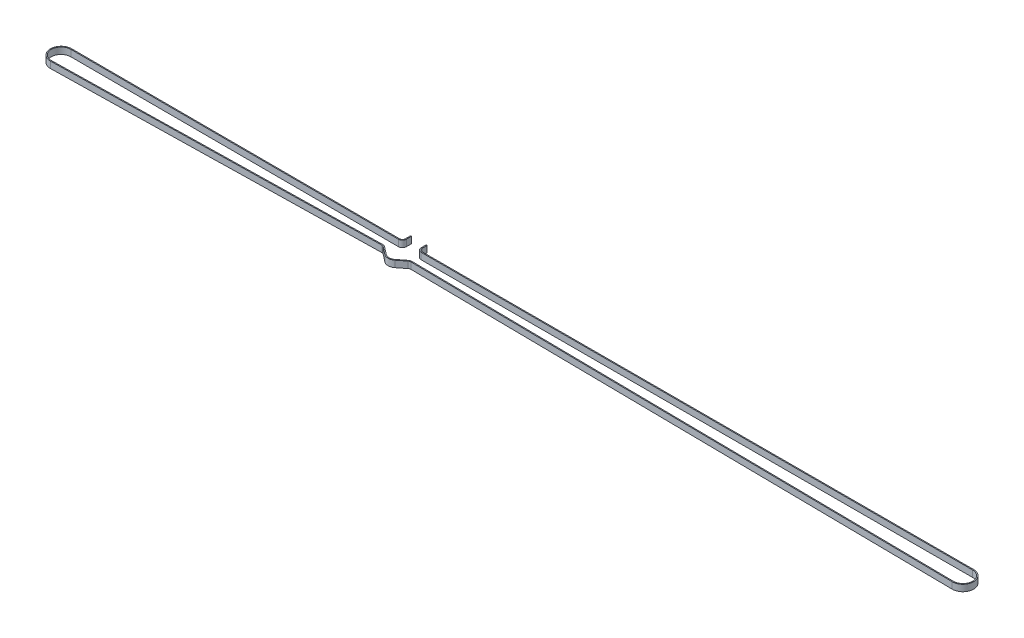
ISO-10303-21;
HEADER;
FILE_DESCRIPTION(('STEP AP214'),'2;1');
FILE_NAME('part.step','',(''),(''),'','','');
FILE_SCHEMA(('AUTOMOTIVE_DESIGN { 1 0 10303 214 1 1 1 1 }'));
ENDSEC;
DATA;
#1=APPLICATION_CONTEXT('core data for automotive mechanical design processes');
#2=APPLICATION_PROTOCOL_DEFINITION('international standard','automotive_design',2000,#1);
#3=PRODUCT_CONTEXT('',#1,'mechanical');
#4=PRODUCT('Part','Part','',(#3));
#5=PRODUCT_RELATED_PRODUCT_CATEGORY('part','',(#4));
#6=PRODUCT_DEFINITION_FORMATION('','',#4);
#7=PRODUCT_DEFINITION_CONTEXT('part definition',#1,'design');
#8=PRODUCT_DEFINITION('design','',#6,#7);
#9=PRODUCT_DEFINITION_SHAPE('','',#8);
#10=(LENGTH_UNIT() NAMED_UNIT(*) SI_UNIT(.MILLI.,.METRE.));
#11=(NAMED_UNIT(*) PLANE_ANGLE_UNIT() SI_UNIT($,.RADIAN.));
#12=(NAMED_UNIT(*) SI_UNIT($,.STERADIAN.) SOLID_ANGLE_UNIT());
#13=UNCERTAINTY_MEASURE_WITH_UNIT(LENGTH_MEASURE(1.E-05),#10,'distance_accuracy_value','');
#14=(GEOMETRIC_REPRESENTATION_CONTEXT(3) GLOBAL_UNCERTAINTY_ASSIGNED_CONTEXT((#13)) GLOBAL_UNIT_ASSIGNED_CONTEXT((#10,
#11,#12)) REPRESENTATION_CONTEXT('',''));
#15=CARTESIAN_POINT('',(0.,0.,0.));
#16=DIRECTION('',(0.,0.,1.));
#17=DIRECTION('',(1.,0.,0.));
#18=AXIS2_PLACEMENT_3D('',#15,#16,#17);
#19=CARTESIAN_POINT('',(-159.099999189377,5.,-27.99999999992));
#20=DIRECTION('',(-1.,0.,0.));
#21=DIRECTION('',(0.,0.,1.));
#22=AXIS2_PLACEMENT_3D('',#19,#20,#21);
#23=PLANE('',#22);
#24=DIRECTION('',(0.,0.,-1.));
#25=VECTOR('',#24,1.);
#26=CARTESIAN_POINT('',(-159.099999189377,-5.,-27.99999999992));
#27=LINE('',#26,#25);
#28=CARTESIAN_POINT('',(-159.099999189377,-5.,-19.99999999992));
#29=VERTEX_POINT('',#28);
#30=CARTESIAN_POINT('',(-159.099999189377,-5.,-27.99999999992));
#31=VERTEX_POINT('',#30);
#32=EDGE_CURVE('E276',#29,#31,#27,.T.);
#33=ORIENTED_EDGE('',*,*,#32,.T.);
#34=DIRECTION('',(0.,-1.,0.));
#35=VECTOR('',#34,1.);
#36=CARTESIAN_POINT('',(-159.099999189377,5.,-27.99999999992));
#37=LINE('',#36,#35);
#38=CARTESIAN_POINT('',(-159.099999189377,5.,-27.99999999992));
#39=VERTEX_POINT('',#38);
#40=EDGE_CURVE('E11',#39,#31,#37,.T.);
#41=ORIENTED_EDGE('',*,*,#40,.F.);
#42=DIRECTION('',(0.,0.,-1.));
#43=VECTOR('',#42,1.);
#44=CARTESIAN_POINT('',(-159.099999189377,5.,-27.99999999992));
#45=LINE('',#44,#43);
#46=CARTESIAN_POINT('',(-159.099999189377,5.,-19.99999999992));
#47=VERTEX_POINT('',#46);
#48=EDGE_CURVE('E165',#47,#39,#45,.T.);
#49=ORIENTED_EDGE('',*,*,#48,.F.);
#50=DIRECTION('',(0.,-1.,0.));
#51=VECTOR('',#50,1.);
#52=CARTESIAN_POINT('',(-159.099999189377,5.,-19.99999999992));
#53=LINE('',#52,#51);
#54=EDGE_CURVE('E272',#47,#29,#53,.T.);
#55=ORIENTED_EDGE('',*,*,#54,.T.);
#56=EDGE_LOOP('',(#33,#41,#49,#55));
#57=FACE_BOUND('',#56,.T.);
#58=ADVANCED_FACE('F37',(#57),#23,.F.);
#59=CARTESIAN_POINT('',(-160.599999189377,5.,-27.99999999992));
#60=DIRECTION('',(0.,0.,-1.));
#61=DIRECTION('',(-1.,0.,0.));
#62=AXIS2_PLACEMENT_3D('',#59,#60,#61);
#63=PLANE('',#62);
#64=DIRECTION('',(1.,0.,0.));
#65=VECTOR('',#64,1.);
#66=CARTESIAN_POINT('',(-160.599999189377,-5.,-27.99999999992));
#67=LINE('',#66,#65);
#68=CARTESIAN_POINT('',(-160.599999189377,-5.,-27.99999999992));
#69=VERTEX_POINT('',#68);
#70=EDGE_CURVE('E279',#69,#31,#67,.T.);
#71=ORIENTED_EDGE('',*,*,#70,.F.);
#72=DIRECTION('',(0.,-1.,0.));
#73=VECTOR('',#72,1.);
#74=CARTESIAN_POINT('',(-160.599999189377,5.,-27.99999999992));
#75=LINE('',#74,#73);
#76=CARTESIAN_POINT('',(-160.599999189377,5.,-27.99999999992));
#77=VERTEX_POINT('',#76);
#78=EDGE_CURVE('E45',#77,#69,#75,.T.);
#79=ORIENTED_EDGE('',*,*,#78,.F.);
#80=DIRECTION('',(1.,0.,0.));
#81=VECTOR('',#80,1.);
#82=CARTESIAN_POINT('',(-160.599999189377,5.,-27.99999999992));
#83=LINE('',#82,#81);
#84=EDGE_CURVE('E441',#77,#39,#83,.T.);
#85=ORIENTED_EDGE('',*,*,#84,.T.);
#86=ORIENTED_EDGE('',*,*,#40,.T.);
#87=EDGE_LOOP('',(#71,#79,#85,#86));
#88=FACE_BOUND('',#87,.T.);
#89=ADVANCED_FACE('F428',(#88),#63,.T.);
#90=CARTESIAN_POINT('',(-160.599999189377,5.,-27.99999999992));
#91=DIRECTION('',(-1.,0.,0.));
#92=DIRECTION('',(0.,0.,1.));
#93=AXIS2_PLACEMENT_3D('',#90,#91,#92);
#94=PLANE('',#93);
#95=DIRECTION('',(0.,0.,-1.));
#96=VECTOR('',#95,1.);
#97=CARTESIAN_POINT('',(-160.599999189377,-5.,-27.99999999992));
#98=LINE('',#97,#96);
#99=CARTESIAN_POINT('',(-160.599999189377,-5.,-19.99999999992));
#100=VERTEX_POINT('',#99);
#101=EDGE_CURVE('E282',#100,#69,#98,.T.);
#102=ORIENTED_EDGE('',*,*,#101,.F.);
#103=DIRECTION('',(0.,-1.,0.));
#104=VECTOR('',#103,1.);
#105=CARTESIAN_POINT('',(-160.599999189377,5.,-19.99999999992));
#106=LINE('',#105,#104);
#107=CARTESIAN_POINT('',(-160.599999189377,5.,-19.99999999992));
#108=VERTEX_POINT('',#107);
#109=EDGE_CURVE('E418',#108,#100,#106,.T.);
#110=ORIENTED_EDGE('',*,*,#109,.F.);
#111=DIRECTION('',(0.,0.,-1.));
#112=VECTOR('',#111,1.);
#113=CARTESIAN_POINT('',(-160.599999189377,5.,-27.99999999992));
#114=LINE('',#113,#112);
#115=EDGE_CURVE('E425',#108,#77,#114,.T.);
#116=ORIENTED_EDGE('',*,*,#115,.T.);
#117=ORIENTED_EDGE('',*,*,#78,.T.);
#118=EDGE_LOOP('',(#102,#110,#116,#117));
#119=FACE_BOUND('',#118,.T.);
#120=ADVANCED_FACE('F423',(#119),#94,.T.);
#121=CARTESIAN_POINT('',(-154.599995052563,5.,-19.99999999992));
#122=DIRECTION('',(0.,-1.,0.));
#123=DIRECTION('',(0.,0.,-1.));
#124=AXIS2_PLACEMENT_3D('',#121,#122,#123);
#125=CYLINDRICAL_SURFACE('',#124,6.0000041368137);
#126=CARTESIAN_POINT('',(-154.599995052563,-5.,-19.99999999992));
#127=DIRECTION('',(0.,-1.,0.));
#128=DIRECTION('',(0.,0.,1.));
#129=AXIS2_PLACEMENT_3D('',#126,#127,#128);
#130=CIRCLE('',#129,6.0000041368137);
#131=CARTESIAN_POINT('',(-154.592949360067,-5.,-13.9999999999201));
#132=VERTEX_POINT('',#131);
#133=EDGE_CURVE('E285',#132,#100,#130,.T.);
#134=ORIENTED_EDGE('',*,*,#133,.F.);
#135=DIRECTION('',(0.,-1.,0.));
#136=VECTOR('',#135,1.);
#137=CARTESIAN_POINT('',(-154.592949360067,5.,-13.9999999999201));
#138=LINE('',#137,#136);
#139=CARTESIAN_POINT('',(-154.592949360067,5.,-13.9999999999201));
#140=VERTEX_POINT('',#139);
#141=EDGE_CURVE('E416',#140,#132,#138,.T.);
#142=ORIENTED_EDGE('',*,*,#141,.F.);
#143=CARTESIAN_POINT('',(-154.599995052563,5.,-19.99999999992));
#144=DIRECTION('',(0.,-1.,0.));
#145=DIRECTION('',(0.,0.,1.));
#146=AXIS2_PLACEMENT_3D('',#143,#144,#145);
#147=CIRCLE('',#146,6.0000041368137);
#148=EDGE_CURVE('E438',#140,#108,#147,.T.);
#149=ORIENTED_EDGE('',*,*,#148,.T.);
#150=ORIENTED_EDGE('',*,*,#109,.T.);
#151=EDGE_LOOP('',(#134,#142,#149,#150));
#152=FACE_BOUND('',#151,.T.);
#153=ADVANCED_FACE('F435',(#152),#125,.T.);
#154=CARTESIAN_POINT('',(-154.592949360067,5.,-13.9999999999201));
#155=DIRECTION('',(0.00117428127298408,0.,0.999999310531508));
#156=DIRECTION('',(0.999999310531508,0.,-0.00117428127298408));
#157=AXIS2_PLACEMENT_3D('',#154,#155,#156);
#158=PLANE('',#157);
#159=DIRECTION('',(-0.999999310531508,0.,0.00117428127298408));
#160=VECTOR('',#159,1.);
#161=CARTESIAN_POINT('',(-154.592949360067,-5.,-13.9999999999201));
#162=LINE('',#161,#160);
#163=CARTESIAN_POINT('',(696.982385780905,-5.,-14.9999896579726));
#164=VERTEX_POINT('',#163);
#165=EDGE_CURVE('E288',#164,#132,#162,.T.);
#166=ORIENTED_EDGE('',*,*,#165,.F.);
#167=DIRECTION('',(0.,-1.,0.));
#168=VECTOR('',#167,1.);
#169=CARTESIAN_POINT('',(696.982385780905,5.,-14.9999896579726));
#170=LINE('',#169,#168);
#171=CARTESIAN_POINT('',(696.982385780905,5.,-14.9999896579726));
#172=VERTEX_POINT('',#171);
#173=EDGE_CURVE('E414',#172,#164,#170,.T.);
#174=ORIENTED_EDGE('',*,*,#173,.F.);
#175=DIRECTION('',(-0.999999310531508,0.,0.00117428127298408));
#176=VECTOR('',#175,1.);
#177=CARTESIAN_POINT('',(-154.592949360067,5.,-13.9999999999201));
#178=LINE('',#177,#176);
#179=EDGE_CURVE('E443',#172,#140,#178,.T.);
#180=ORIENTED_EDGE('',*,*,#179,.T.);
#181=ORIENTED_EDGE('',*,*,#141,.T.);
#182=EDGE_LOOP('',(#166,#174,#180,#181));
#183=FACE_BOUND('',#182,.T.);
#184=ADVANCED_FACE('F539',(#183),#158,.T.);
#185=CARTESIAN_POINT('',(697.,5.,0.));
#186=DIRECTION('',(0.,-1.,0.));
#187=DIRECTION('',(0.,0.,-1.));
#188=AXIS2_PLACEMENT_3D('',#185,#186,#187);
#189=CYLINDRICAL_SURFACE('',#188,15.);
#190=CARTESIAN_POINT('',(697.,-5.,0.));
#191=DIRECTION('',(0.,1.,0.));
#192=DIRECTION('',(0.,0.,1.));
#193=AXIS2_PLACEMENT_3D('',#190,#191,#192);
#194=CIRCLE('',#193,15.);
#195=CARTESIAN_POINT('',(696.826189087548,-5.,14.9989929584193));
#196=VERTEX_POINT('',#195);
#197=EDGE_CURVE('E291',#196,#164,#194,.T.);
#198=ORIENTED_EDGE('',*,*,#197,.F.);
#199=DIRECTION('',(0.,-1.,0.));
#200=VECTOR('',#199,1.);
#201=CARTESIAN_POINT('',(696.826189087548,5.,14.9989929584193));
#202=LINE('',#201,#200);
#203=CARTESIAN_POINT('',(696.826189087548,5.,14.9989929584193));
#204=VERTEX_POINT('',#203);
#205=EDGE_CURVE('E412',#204,#196,#202,.T.);
#206=ORIENTED_EDGE('',*,*,#205,.F.);
#207=CARTESIAN_POINT('',(697.,5.,0.));
#208=DIRECTION('',(0.,1.,0.));
#209=DIRECTION('',(0.,0.,1.));
#210=AXIS2_PLACEMENT_3D('',#207,#208,#209);
#211=CIRCLE('',#210,15.);
#212=EDGE_CURVE('E449',#204,#172,#211,.T.);
#213=ORIENTED_EDGE('',*,*,#212,.T.);
#214=ORIENTED_EDGE('',*,*,#173,.T.);
#215=EDGE_LOOP('',(#198,#206,#213,#214));
#216=FACE_BOUND('',#215,.T.);
#217=ADVANCED_FACE('F542',(#216),#189,.F.);
#218=CARTESIAN_POINT('',(-149.524681206787,5.,5.19133337567673));
#219=DIRECTION('',(0.0115873941634452,0.,-0.999932863894622));
#220=DIRECTION('',(-0.999932863894622,0.,-0.0115873941634452));
#221=AXIS2_PLACEMENT_3D('',#218,#219,#220);
#222=PLANE('',#221);
#223=DIRECTION('',(0.999932863894622,0.,0.0115873941634452));
#224=VECTOR('',#223,1.);
#225=CARTESIAN_POINT('',(-149.524681206787,-5.,5.19133337567673));
#226=LINE('',#225,#224);
#227=CARTESIAN_POINT('',(-149.524681206787,-5.,5.19133337567673));
#228=VERTEX_POINT('',#227);
#229=EDGE_CURVE('E294',#228,#196,#226,.T.);
#230=ORIENTED_EDGE('',*,*,#229,.F.);
#231=DIRECTION('',(0.,-1.,0.));
#232=VECTOR('',#231,1.);
#233=CARTESIAN_POINT('',(-149.524681206787,5.,5.19133337567673));
#234=LINE('',#233,#232);
#235=CARTESIAN_POINT('',(-149.524681206787,5.,5.19133337567673));
#236=VERTEX_POINT('',#235);
#237=EDGE_CURVE('E410',#236,#228,#234,.T.);
#238=ORIENTED_EDGE('',*,*,#237,.F.);
#239=DIRECTION('',(0.999932863894622,0.,0.0115873941634452));
#240=VECTOR('',#239,1.);
#241=CARTESIAN_POINT('',(-149.524681206787,5.,5.19133337567673));
#242=LINE('',#241,#240);
#243=EDGE_CURVE('E452',#236,#204,#242,.T.);
#244=ORIENTED_EDGE('',*,*,#243,.T.);
#245=ORIENTED_EDGE('',*,*,#205,.T.);
#246=EDGE_LOOP('',(#230,#238,#244,#245));
#247=FACE_BOUND('',#246,.T.);
#248=ADVANCED_FACE('F546',(#247),#222,.T.);
#249=CARTESIAN_POINT('',(-149.599999268849,5.,11.6908969909918));
#250=DIRECTION('',(0.,-1.,0.));
#251=DIRECTION('',(0.,0.,-1.));
#252=AXIS2_PLACEMENT_3D('',#249,#250,#251);
#253=CYLINDRICAL_SURFACE('',#252,6.49999999999999);
#254=CARTESIAN_POINT('',(-149.599999268849,-5.,11.6908969909918));
#255=DIRECTION('',(0.,-1.,0.));
#256=DIRECTION('',(0.,0.,1.));
#257=AXIS2_PLACEMENT_3D('',#254,#255,#256);
#258=CIRCLE('',#257,6.49999999999999);
#259=CARTESIAN_POINT('',(-153.606210927465,-5.,6.57227724086695));
#260=VERTEX_POINT('',#259);
#261=EDGE_CURVE('E297',#260,#228,#258,.T.);
#262=ORIENTED_EDGE('',*,*,#261,.F.);
#263=DIRECTION('',(0.,-1.,0.));
#264=VECTOR('',#263,1.);
#265=CARTESIAN_POINT('',(-153.606210927465,5.,6.57227724086695));
#266=LINE('',#265,#264);
#267=CARTESIAN_POINT('',(-153.606210927465,5.,6.57227724086695));
#268=VERTEX_POINT('',#267);
#269=EDGE_CURVE('E408',#268,#260,#266,.T.);
#270=ORIENTED_EDGE('',*,*,#269,.F.);
#271=CARTESIAN_POINT('',(-149.599999268849,5.,11.6908969909918));
#272=DIRECTION('',(0.,-1.,0.));
#273=DIRECTION('',(0.,0.,1.));
#274=AXIS2_PLACEMENT_3D('',#271,#272,#273);
#275=CIRCLE('',#274,6.49999999999999);
#276=EDGE_CURVE('E455',#268,#236,#275,.T.);
#277=ORIENTED_EDGE('',*,*,#276,.T.);
#278=ORIENTED_EDGE('',*,*,#237,.T.);
#279=EDGE_LOOP('',(#262,#270,#277,#278));
#280=FACE_BOUND('',#279,.T.);
#281=ADVANCED_FACE('F550',(#280),#253,.T.);
#282=CARTESIAN_POINT('',(-165.220257193111,5.,15.6622917026761));
#283=DIRECTION('',(-0.616340255171715,0.,-0.787479961557667));
#284=DIRECTION('',(-0.787479961557667,0.,0.616340255171715));
#285=AXIS2_PLACEMENT_3D('',#282,#283,#284);
#286=PLANE('',#285);
#287=DIRECTION('',(0.787479961557667,0.,-0.616340255171715));
#288=VECTOR('',#287,1.);
#289=CARTESIAN_POINT('',(-165.220257193111,-5.,15.6622917026761));
#290=LINE('',#289,#288);
#291=CARTESIAN_POINT('',(-165.220257193111,-5.,15.6622917026761));
#292=VERTEX_POINT('',#291);
#293=EDGE_CURVE('E300',#292,#260,#290,.T.);
#294=ORIENTED_EDGE('',*,*,#293,.F.);
#295=DIRECTION('',(0.,-1.,0.));
#296=VECTOR('',#295,1.);
#297=CARTESIAN_POINT('',(-165.220257193111,5.,15.6622917026761));
#298=LINE('',#297,#296);
#299=CARTESIAN_POINT('',(-165.220257193111,5.,15.6622917026761));
#300=VERTEX_POINT('',#299);
#301=EDGE_CURVE('E406',#300,#292,#298,.T.);
#302=ORIENTED_EDGE('',*,*,#301,.F.);
#303=DIRECTION('',(0.787479961557667,0.,-0.616340255171715));
#304=VECTOR('',#303,1.);
#305=CARTESIAN_POINT('',(-165.220257193111,5.,15.6622917026761));
#306=LINE('',#305,#304);
#307=EDGE_CURVE('E458',#300,#268,#306,.T.);
#308=ORIENTED_EDGE('',*,*,#307,.T.);
#309=ORIENTED_EDGE('',*,*,#269,.T.);
#310=EDGE_LOOP('',(#294,#302,#308,#309));
#311=FACE_BOUND('',#310,.T.);
#312=ADVANCED_FACE('F554',(#311),#286,.T.);
#313=CARTESIAN_POINT('',(-172.,5.,7.0000121255418));
#314=DIRECTION('',(0.,-1.,0.));
#315=DIRECTION('',(0.,0.,-1.));
#316=AXIS2_PLACEMENT_3D('',#313,#314,#315);
#317=CYLINDRICAL_SURFACE('',#316,11.);
#318=CARTESIAN_POINT('',(-172.,-5.,7.0000121255418));
#319=DIRECTION('',(0.,1.,0.));
#320=DIRECTION('',(0.,0.,1.));
#321=AXIS2_PLACEMENT_3D('',#318,#319,#320);
#322=CIRCLE('',#321,11.);
#323=CARTESIAN_POINT('',(-178.779742806889,-5.,15.6622917026761));
#324=VERTEX_POINT('',#323);
#325=EDGE_CURVE('E303',#324,#292,#322,.T.);
#326=ORIENTED_EDGE('',*,*,#325,.F.);
#327=DIRECTION('',(0.,-1.,0.));
#328=VECTOR('',#327,1.);
#329=CARTESIAN_POINT('',(-178.779742806889,5.,15.6622917026761));
#330=LINE('',#329,#328);
#331=CARTESIAN_POINT('',(-178.779742806889,5.,15.6622917026761));
#332=VERTEX_POINT('',#331);
#333=EDGE_CURVE('E404',#332,#324,#330,.T.);
#334=ORIENTED_EDGE('',*,*,#333,.F.);
#335=CARTESIAN_POINT('',(-172.,5.,7.0000121255418));
#336=DIRECTION('',(0.,1.,0.));
#337=DIRECTION('',(0.,0.,1.));
#338=AXIS2_PLACEMENT_3D('',#335,#336,#337);
#339=CIRCLE('',#338,11.);
#340=EDGE_CURVE('E461',#332,#300,#339,.T.);
#341=ORIENTED_EDGE('',*,*,#340,.T.);
#342=ORIENTED_EDGE('',*,*,#301,.T.);
#343=EDGE_LOOP('',(#326,#334,#341,#342));
#344=FACE_BOUND('',#343,.T.);
#345=ADVANCED_FACE('F558',(#344),#317,.F.);
#346=CARTESIAN_POINT('',(-190.393789072534,5.,6.57227724086698));
#347=DIRECTION('',(0.616340255171717,0.,-0.787479961557666));
#348=DIRECTION('',(-0.787479961557666,0.,-0.616340255171717));
#349=AXIS2_PLACEMENT_3D('',#346,#347,#348);
#350=PLANE('',#349);
#351=DIRECTION('',(0.787479961557666,0.,0.616340255171717));
#352=VECTOR('',#351,1.);
#353=CARTESIAN_POINT('',(-190.393789072534,-5.,6.57227724086698));
#354=LINE('',#353,#352);
#355=CARTESIAN_POINT('',(-190.393789072534,-5.,6.57227724086698));
#356=VERTEX_POINT('',#355);
#357=EDGE_CURVE('E306',#356,#324,#354,.T.);
#358=ORIENTED_EDGE('',*,*,#357,.F.);
#359=DIRECTION('',(0.,-1.,0.));
#360=VECTOR('',#359,1.);
#361=CARTESIAN_POINT('',(-190.393789072534,5.,6.57227724086698));
#362=LINE('',#361,#360);
#363=CARTESIAN_POINT('',(-190.393789072534,5.,6.57227724086698));
#364=VERTEX_POINT('',#363);
#365=EDGE_CURVE('E402',#364,#356,#362,.T.);
#366=ORIENTED_EDGE('',*,*,#365,.F.);
#367=DIRECTION('',(0.787479961557666,0.,0.616340255171717));
#368=VECTOR('',#367,1.);
#369=CARTESIAN_POINT('',(-190.393789072534,5.,6.57227724086698));
#370=LINE('',#369,#368);
#371=EDGE_CURVE('E464',#364,#332,#370,.T.);
#372=ORIENTED_EDGE('',*,*,#371,.T.);
#373=ORIENTED_EDGE('',*,*,#333,.T.);
#374=EDGE_LOOP('',(#358,#366,#372,#373));
#375=FACE_BOUND('',#374,.T.);
#376=ADVANCED_FACE('F562',(#375),#350,.T.);
#377=CARTESIAN_POINT('',(-194.400000731151,5.,11.6908969909918));
#378=DIRECTION('',(0.,-1.,0.));
#379=DIRECTION('',(0.,0.,-1.));
#380=AXIS2_PLACEMENT_3D('',#377,#378,#379);
#381=CYLINDRICAL_SURFACE('',#380,6.49999999999998);
#382=CARTESIAN_POINT('',(-194.400000731151,-5.,11.6908969909918));
#383=DIRECTION('',(0.,-1.,0.));
#384=DIRECTION('',(0.,0.,1.));
#385=AXIS2_PLACEMENT_3D('',#382,#383,#384);
#386=CIRCLE('',#385,6.49999999999998);
#387=CARTESIAN_POINT('',(-194.526888216522,-5.,5.19213560392302));
#388=VERTEX_POINT('',#387);
#389=EDGE_CURVE('E309',#388,#356,#386,.T.);
#390=ORIENTED_EDGE('',*,*,#389,.F.);
#391=DIRECTION('',(0.,-1.,0.));
#392=VECTOR('',#391,1.);
#393=CARTESIAN_POINT('',(-194.526888216522,5.,5.19213560392302));
#394=LINE('',#393,#392);
#395=CARTESIAN_POINT('',(-194.526888216522,5.,5.19213560392302));
#396=VERTEX_POINT('',#395);
#397=EDGE_CURVE('E400',#396,#388,#394,.T.);
#398=ORIENTED_EDGE('',*,*,#397,.F.);
#399=CARTESIAN_POINT('',(-194.400000731151,5.,11.6908969909918));
#400=DIRECTION('',(0.,-1.,0.));
#401=DIRECTION('',(0.,0.,1.));
#402=AXIS2_PLACEMENT_3D('',#399,#400,#401);
#403=CIRCLE('',#402,6.49999999999998);
#404=EDGE_CURVE('E467',#396,#364,#403,.T.);
#405=ORIENTED_EDGE('',*,*,#404,.T.);
#406=ORIENTED_EDGE('',*,*,#365,.T.);
#407=EDGE_LOOP('',(#390,#398,#405,#406));
#408=FACE_BOUND('',#407,.T.);
#409=ADVANCED_FACE('F566',(#408),#381,.T.);
#410=CARTESIAN_POINT('',(-696.707182726067,5.,14.9971416624664));
#411=DIRECTION('',(-0.0195211515955547,0.,-0.999809444164429));
#412=DIRECTION('',(-0.999809444164429,0.,0.0195211515955547));
#413=AXIS2_PLACEMENT_3D('',#410,#411,#412);
#414=PLANE('',#413);
#415=DIRECTION('',(0.999809444164429,0.,-0.0195211515955547));
#416=VECTOR('',#415,1.);
#417=CARTESIAN_POINT('',(-696.707182726067,-5.,14.9971416624664));
#418=LINE('',#417,#416);
#419=CARTESIAN_POINT('',(-696.707182726067,-5.,14.9971416624664));
#420=VERTEX_POINT('',#419);
#421=EDGE_CURVE('E312',#420,#388,#418,.T.);
#422=ORIENTED_EDGE('',*,*,#421,.F.);
#423=DIRECTION('',(0.,-1.,0.));
#424=VECTOR('',#423,1.);
#425=CARTESIAN_POINT('',(-696.707182726067,5.,14.9971416624664));
#426=LINE('',#425,#424);
#427=CARTESIAN_POINT('',(-696.707182726067,5.,14.9971416624664));
#428=VERTEX_POINT('',#427);
#429=EDGE_CURVE('E398',#428,#420,#426,.T.);
#430=ORIENTED_EDGE('',*,*,#429,.F.);
#431=DIRECTION('',(0.999809444164429,0.,-0.0195211515955547));
#432=VECTOR('',#431,1.);
#433=CARTESIAN_POINT('',(-696.707182726067,5.,14.9971416624664));
#434=LINE('',#433,#432);
#435=EDGE_CURVE('E470',#428,#396,#434,.T.);
#436=ORIENTED_EDGE('',*,*,#435,.T.);
#437=ORIENTED_EDGE('',*,*,#397,.T.);
#438=EDGE_LOOP('',(#422,#430,#436,#437));
#439=FACE_BOUND('',#438,.T.);
#440=ADVANCED_FACE('F570',(#439),#414,.T.);
#441=CARTESIAN_POINT('',(-697.,5.,0.));
#442=DIRECTION('',(0.,-1.,0.));
#443=DIRECTION('',(0.,0.,-1.));
#444=AXIS2_PLACEMENT_3D('',#441,#442,#443);
#445=CYLINDRICAL_SURFACE('',#444,15.);
#446=CARTESIAN_POINT('',(-697.,-5.,0.));
#447=DIRECTION('',(0.,1.,0.));
#448=DIRECTION('',(0.,0.,1.));
#449=AXIS2_PLACEMENT_3D('',#446,#447,#448);
#450=CIRCLE('',#449,15.);
#451=CARTESIAN_POINT('',(-696.970447680724,-5.,-14.9999708886526));
#452=VERTEX_POINT('',#451);
#453=EDGE_CURVE('E315',#452,#420,#450,.T.);
#454=ORIENTED_EDGE('',*,*,#453,.F.);
#455=DIRECTION('',(0.,-1.,0.));
#456=VECTOR('',#455,1.);
#457=CARTESIAN_POINT('',(-696.970447680724,5.,-14.9999708886526));
#458=LINE('',#457,#456);
#459=CARTESIAN_POINT('',(-696.970447680724,5.,-14.9999708886526));
#460=VERTEX_POINT('',#459);
#461=EDGE_CURVE('E396',#460,#452,#458,.T.);
#462=ORIENTED_EDGE('',*,*,#461,.F.);
#463=CARTESIAN_POINT('',(-697.,5.,0.));
#464=DIRECTION('',(0.,1.,0.));
#465=DIRECTION('',(0.,0.,1.));
#466=AXIS2_PLACEMENT_3D('',#463,#464,#465);
#467=CIRCLE('',#466,15.);
#468=EDGE_CURVE('E473',#460,#428,#467,.T.);
#469=ORIENTED_EDGE('',*,*,#468,.T.);
#470=ORIENTED_EDGE('',*,*,#429,.T.);
#471=EDGE_LOOP('',(#454,#462,#469,#470));
#472=FACE_BOUND('',#471,.T.);
#473=ADVANCED_FACE('F574',(#472),#445,.F.);
#474=CARTESIAN_POINT('',(-189.411833405837,5.,-13.9999999999201));
#475=DIRECTION('',(-0.00197015461842,0.,0.999998059243506));
#476=DIRECTION('',(0.999998059243506,0.,0.00197015461842));
#477=AXIS2_PLACEMENT_3D('',#474,#475,#476);
#478=PLANE('',#477);
#479=DIRECTION('',(-0.999998059243506,0.,-0.00197015461842));
#480=VECTOR('',#479,1.);
#481=CARTESIAN_POINT('',(-189.411833405837,-5.,-13.9999999999201));
#482=LINE('',#481,#480);
#483=CARTESIAN_POINT('',(-189.411833405837,-5.,-13.9999999999201));
#484=VERTEX_POINT('',#483);
#485=EDGE_CURVE('E318',#484,#452,#482,.T.);
#486=ORIENTED_EDGE('',*,*,#485,.F.);
#487=DIRECTION('',(0.,-1.,0.));
#488=VECTOR('',#487,1.);
#489=CARTESIAN_POINT('',(-189.411833405837,5.,-13.9999999999201));
#490=LINE('',#489,#488);
#491=CARTESIAN_POINT('',(-189.411833405837,5.,-13.9999999999201));
#492=VERTEX_POINT('',#491);
#493=EDGE_CURVE('E394',#492,#484,#490,.T.);
#494=ORIENTED_EDGE('',*,*,#493,.F.);
#495=DIRECTION('',(-0.999998059243506,0.,-0.00197015461842));
#496=VECTOR('',#495,1.);
#497=CARTESIAN_POINT('',(-189.411833405837,5.,-13.9999999999201));
#498=LINE('',#497,#496);
#499=EDGE_CURVE('E476',#492,#460,#498,.T.);
#500=ORIENTED_EDGE('',*,*,#499,.T.);
#501=ORIENTED_EDGE('',*,*,#461,.T.);
#502=EDGE_LOOP('',(#486,#494,#500,#501));
#503=FACE_BOUND('',#502,.T.);
#504=ADVANCED_FACE('F578',(#503),#478,.T.);
#505=CARTESIAN_POINT('',(-189.400012455185,5.,-19.99999999992));
#506=DIRECTION('',(0.,-1.,0.));
#507=DIRECTION('',(0.,0.,-1.));
#508=AXIS2_PLACEMENT_3D('',#505,#506,#507);
#509=CYLINDRICAL_SURFACE('',#508,6.00001164456146);
#510=CARTESIAN_POINT('',(-189.400012455185,-5.,-19.99999999992));
#511=DIRECTION('',(0.,-1.,0.));
#512=DIRECTION('',(0.,0.,-1.));
#513=AXIS2_PLACEMENT_3D('',#510,#511,#512);
#514=CIRCLE('',#513,6.00001164456146);
#515=CARTESIAN_POINT('',(-183.400000810623,-5.,-19.99999999992));
#516=VERTEX_POINT('',#515);
#517=EDGE_CURVE('E321',#516,#484,#514,.T.);
#518=ORIENTED_EDGE('',*,*,#517,.F.);
#519=DIRECTION('',(0.,-1.,0.));
#520=VECTOR('',#519,1.);
#521=CARTESIAN_POINT('',(-183.400000810623,5.,-19.99999999992));
#522=LINE('',#521,#520);
#523=CARTESIAN_POINT('',(-183.400000810623,5.,-19.99999999992));
#524=VERTEX_POINT('',#523);
#525=EDGE_CURVE('E392',#524,#516,#522,.T.);
#526=ORIENTED_EDGE('',*,*,#525,.F.);
#527=CARTESIAN_POINT('',(-189.400012455185,5.,-19.99999999992));
#528=DIRECTION('',(0.,-1.,0.));
#529=DIRECTION('',(0.,0.,-1.));
#530=AXIS2_PLACEMENT_3D('',#527,#528,#529);
#531=CIRCLE('',#530,6.00001164456146);
#532=EDGE_CURVE('E479',#524,#492,#531,.T.);
#533=ORIENTED_EDGE('',*,*,#532,.T.);
#534=ORIENTED_EDGE('',*,*,#493,.T.);
#535=EDGE_LOOP('',(#518,#526,#533,#534));
#536=FACE_BOUND('',#535,.T.);
#537=ADVANCED_FACE('F582',(#536),#509,.T.);
#538=CARTESIAN_POINT('',(-183.400000810623,5.,-27.99999999992));
#539=DIRECTION('',(1.,0.,0.));
#540=DIRECTION('',(0.,0.,-1.));
#541=AXIS2_PLACEMENT_3D('',#538,#539,#540);
#542=PLANE('',#541);
#543=DIRECTION('',(0.,0.,1.));
#544=VECTOR('',#543,1.);
#545=CARTESIAN_POINT('',(-183.400000810623,-5.,-27.99999999992));
#546=LINE('',#545,#544);
#547=CARTESIAN_POINT('',(-183.400000810623,-5.,-27.99999999992));
#548=VERTEX_POINT('',#547);
#549=EDGE_CURVE('E324',#548,#516,#546,.T.);
#550=ORIENTED_EDGE('',*,*,#549,.F.);
#551=DIRECTION('',(0.,-1.,0.));
#552=VECTOR('',#551,1.);
#553=CARTESIAN_POINT('',(-183.400000810623,5.,-27.99999999992));
#554=LINE('',#553,#552);
#555=CARTESIAN_POINT('',(-183.400000810623,5.,-27.99999999992));
#556=VERTEX_POINT('',#555);
#557=EDGE_CURVE('E390',#556,#548,#554,.T.);
#558=ORIENTED_EDGE('',*,*,#557,.F.);
#559=DIRECTION('',(0.,0.,1.));
#560=VECTOR('',#559,1.);
#561=CARTESIAN_POINT('',(-183.400000810623,5.,-27.99999999992));
#562=LINE('',#561,#560);
#563=EDGE_CURVE('E482',#556,#524,#562,.T.);
#564=ORIENTED_EDGE('',*,*,#563,.T.);
#565=ORIENTED_EDGE('',*,*,#525,.T.);
#566=EDGE_LOOP('',(#550,#558,#564,#565));
#567=FACE_BOUND('',#566,.T.);
#568=ADVANCED_FACE('F586',(#567),#542,.T.);
#569=CARTESIAN_POINT('',(-184.900000810623,5.,-27.99999999992));
#570=DIRECTION('',(0.,0.,-1.));
#571=DIRECTION('',(-1.,0.,0.));
#572=AXIS2_PLACEMENT_3D('',#569,#570,#571);
#573=PLANE('',#572);
#574=DIRECTION('',(1.,0.,0.));
#575=VECTOR('',#574,1.);
#576=CARTESIAN_POINT('',(-184.900000810623,-5.,-27.99999999992));
#577=LINE('',#576,#575);
#578=CARTESIAN_POINT('',(-184.900000810623,-5.,-27.99999999992));
#579=VERTEX_POINT('',#578);
#580=EDGE_CURVE('E327',#579,#548,#577,.T.);
#581=ORIENTED_EDGE('',*,*,#580,.F.);
#582=DIRECTION('',(0.,-1.,0.));
#583=VECTOR('',#582,1.);
#584=CARTESIAN_POINT('',(-184.900000810623,5.,-27.99999999992));
#585=LINE('',#584,#583);
#586=CARTESIAN_POINT('',(-184.900000810623,5.,-27.99999999992));
#587=VERTEX_POINT('',#586);
#588=EDGE_CURVE('E388',#587,#579,#585,.T.);
#589=ORIENTED_EDGE('',*,*,#588,.F.);
#590=DIRECTION('',(1.,0.,0.));
#591=VECTOR('',#590,1.);
#592=CARTESIAN_POINT('',(-184.900000810623,5.,-27.99999999992));
#593=LINE('',#592,#591);
#594=EDGE_CURVE('E485',#587,#556,#593,.T.);
#595=ORIENTED_EDGE('',*,*,#594,.T.);
#596=ORIENTED_EDGE('',*,*,#557,.T.);
#597=EDGE_LOOP('',(#581,#589,#595,#596));
#598=FACE_BOUND('',#597,.T.);
#599=ADVANCED_FACE('F590',(#598),#573,.T.);
#600=CARTESIAN_POINT('',(-184.900000810623,5.,-27.99999999992));
#601=DIRECTION('',(1.,0.,0.));
#602=DIRECTION('',(0.,0.,-1.));
#603=AXIS2_PLACEMENT_3D('',#600,#601,#602);
#604=PLANE('',#603);
#605=DIRECTION('',(0.,0.,-1.));
#606=VECTOR('',#605,1.);
#607=CARTESIAN_POINT('',(-184.900000810623,-5.,-27.99999999992));
#608=LINE('',#607,#606);
#609=CARTESIAN_POINT('',(-184.900000810623,-5.,-19.99999999992));
#610=VERTEX_POINT('',#609);
#611=EDGE_CURVE('E330',#579,#610,#608,.F.);
#612=ORIENTED_EDGE('',*,*,#611,.T.);
#613=DIRECTION('',(0.,-1.,0.));
#614=VECTOR('',#613,1.);
#615=CARTESIAN_POINT('',(-184.900000810623,5.,-19.99999999992));
#616=LINE('',#615,#614);
#617=CARTESIAN_POINT('',(-184.900000810623,5.,-19.99999999992));
#618=VERTEX_POINT('',#617);
#619=EDGE_CURVE('E385',#618,#610,#616,.T.);
#620=ORIENTED_EDGE('',*,*,#619,.F.);
#621=DIRECTION('',(0.,0.,-1.));
#622=VECTOR('',#621,1.);
#623=CARTESIAN_POINT('',(-184.900000810623,5.,-27.99999999992));
#624=LINE('',#623,#622);
#625=EDGE_CURVE('E488',#587,#618,#624,.F.);
#626=ORIENTED_EDGE('',*,*,#625,.F.);
#627=ORIENTED_EDGE('',*,*,#588,.T.);
#628=EDGE_LOOP('',(#612,#620,#626,#627));
#629=FACE_BOUND('',#628,.T.);
#630=ADVANCED_FACE('F594',(#629),#604,.F.);
#631=CARTESIAN_POINT('',(-189.400012455185,5.,-19.99999999992));
#632=DIRECTION('',(0.,-1.,0.));
#633=DIRECTION('',(0.,0.,-1.));
#634=AXIS2_PLACEMENT_3D('',#631,#632,#633);
#635=CYLINDRICAL_SURFACE('',#634,4.50001164456146);
#636=CARTESIAN_POINT('',(-189.400012455185,-5.,-19.99999999992));
#637=DIRECTION('',(0.,1.,0.));
#638=DIRECTION('',(1.,0.,0.));
#639=AXIS2_PLACEMENT_3D('',#636,#637,#638);
#640=CIRCLE('',#639,4.50001164456146);
#641=CARTESIAN_POINT('',(-189.408878173909,-5.,-15.4999970887853));
#642=VERTEX_POINT('',#641);
#643=EDGE_CURVE('E332',#610,#642,#640,.F.);
#644=ORIENTED_EDGE('',*,*,#643,.T.);
#645=DIRECTION('',(0.,-1.,0.));
#646=VECTOR('',#645,1.);
#647=CARTESIAN_POINT('',(-189.408878173909,5.,-15.4999970887853));
#648=LINE('',#647,#646);
#649=CARTESIAN_POINT('',(-189.408878173909,5.,-15.4999970887853));
#650=VERTEX_POINT('',#649);
#651=EDGE_CURVE('E382',#650,#642,#648,.T.);
#652=ORIENTED_EDGE('',*,*,#651,.F.);
#653=CARTESIAN_POINT('',(-189.400012455185,5.,-19.99999999992));
#654=DIRECTION('',(0.,1.,0.));
#655=DIRECTION('',(1.,0.,0.));
#656=AXIS2_PLACEMENT_3D('',#653,#654,#655);
#657=CIRCLE('',#656,4.50001164456146);
#658=EDGE_CURVE('E490',#618,#650,#657,.F.);
#659=ORIENTED_EDGE('',*,*,#658,.F.);
#660=ORIENTED_EDGE('',*,*,#619,.T.);
#661=EDGE_LOOP('',(#644,#652,#659,#660));
#662=FACE_BOUND('',#661,.T.);
#663=ADVANCED_FACE('F598',(#662),#635,.F.);
#664=CARTESIAN_POINT('',(-189.408878173909,5.,-15.4999970887853));
#665=DIRECTION('',(-0.00197015461842,0.,0.999998059243506));
#666=DIRECTION('',(0.999998059243506,0.,0.00197015461842));
#667=AXIS2_PLACEMENT_3D('',#664,#665,#666);
#668=PLANE('',#667);
#669=DIRECTION('',(-0.999998059243506,0.,-0.00197015461842));
#670=VECTOR('',#669,1.);
#671=CARTESIAN_POINT('',(-189.408878173909,-5.,-15.4999970887853));
#672=LINE('',#671,#670);
#673=CARTESIAN_POINT('',(-696.967492448796,-5.,-16.4999679775179));
#674=VERTEX_POINT('',#673);
#675=EDGE_CURVE('E334',#642,#674,#672,.T.);
#676=ORIENTED_EDGE('',*,*,#675,.T.);
#677=DIRECTION('',(0.,-1.,0.));
#678=VECTOR('',#677,1.);
#679=CARTESIAN_POINT('',(-696.967492448796,5.,-16.4999679775179));
#680=LINE('',#679,#678);
#681=CARTESIAN_POINT('',(-696.967492448796,5.,-16.4999679775179));
#682=VERTEX_POINT('',#681);
#683=EDGE_CURVE('E379',#682,#674,#680,.T.);
#684=ORIENTED_EDGE('',*,*,#683,.F.);
#685=DIRECTION('',(-0.999998059243506,0.,-0.00197015461842));
#686=VECTOR('',#685,1.);
#687=CARTESIAN_POINT('',(-189.408878173909,5.,-15.4999970887853));
#688=LINE('',#687,#686);
#689=EDGE_CURVE('E492',#650,#682,#688,.T.);
#690=ORIENTED_EDGE('',*,*,#689,.F.);
#691=ORIENTED_EDGE('',*,*,#651,.T.);
#692=EDGE_LOOP('',(#676,#684,#690,#691));
#693=FACE_BOUND('',#692,.T.);
#694=ADVANCED_FACE('F602',(#693),#668,.F.);
#695=CARTESIAN_POINT('',(-697.,5.,0.));
#696=DIRECTION('',(0.,-1.,0.));
#697=DIRECTION('',(0.,0.,-1.));
#698=AXIS2_PLACEMENT_3D('',#695,#696,#697);
#699=CYLINDRICAL_SURFACE('',#698,16.5);
#700=CARTESIAN_POINT('',(-697.,-5.,0.));
#701=DIRECTION('',(0.,1.,0.));
#702=DIRECTION('',(1.,0.,0.));
#703=AXIS2_PLACEMENT_3D('',#700,#701,#702);
#704=CIRCLE('',#703,16.5);
#705=CARTESIAN_POINT('',(-696.677900998673,-5.,16.4968558287131));
#706=VERTEX_POINT('',#705);
#707=EDGE_CURVE('E336',#674,#706,#704,.T.);
#708=ORIENTED_EDGE('',*,*,#707,.T.);
#709=DIRECTION('',(0.,-1.,0.));
#710=VECTOR('',#709,1.);
#711=CARTESIAN_POINT('',(-696.677900998673,5.,16.4968558287131));
#712=LINE('',#711,#710);
#713=CARTESIAN_POINT('',(-696.677900998673,5.,16.4968558287131));
#714=VERTEX_POINT('',#713);
#715=EDGE_CURVE('E376',#714,#706,#712,.T.);
#716=ORIENTED_EDGE('',*,*,#715,.F.);
#717=CARTESIAN_POINT('',(-697.,5.,0.));
#718=DIRECTION('',(0.,1.,0.));
#719=DIRECTION('',(1.,0.,0.));
#720=AXIS2_PLACEMENT_3D('',#717,#718,#719);
#721=CIRCLE('',#720,16.5);
#722=EDGE_CURVE('E494',#682,#714,#721,.T.);
#723=ORIENTED_EDGE('',*,*,#722,.F.);
#724=ORIENTED_EDGE('',*,*,#683,.T.);
#725=EDGE_LOOP('',(#708,#716,#723,#724));
#726=FACE_BOUND('',#725,.T.);
#727=ADVANCED_FACE('F606',(#726),#699,.T.);
#728=CARTESIAN_POINT('',(-696.677900998673,5.,16.4968558287131));
#729=DIRECTION('',(-0.0195211515955547,0.,-0.999809444164429));
#730=DIRECTION('',(-0.999809444164429,0.,0.0195211515955547));
#731=AXIS2_PLACEMENT_3D('',#728,#729,#730);
#732=PLANE('',#731);
#733=DIRECTION('',(0.999809444164429,0.,-0.0195211515955547));
#734=VECTOR('',#733,1.);
#735=CARTESIAN_POINT('',(-696.677900998673,-5.,16.4968558287131));
#736=LINE('',#735,#734);
#737=CARTESIAN_POINT('',(-194.497606489128,-5.,6.69184977016967));
#738=VERTEX_POINT('',#737);
#739=EDGE_CURVE('E338',#706,#738,#736,.T.);
#740=ORIENTED_EDGE('',*,*,#739,.T.);
#741=DIRECTION('',(0.,-1.,0.));
#742=VECTOR('',#741,1.);
#743=CARTESIAN_POINT('',(-194.497606489128,5.,6.69184977016967));
#744=LINE('',#743,#742);
#745=CARTESIAN_POINT('',(-194.497606489128,5.,6.69184977016967));
#746=VERTEX_POINT('',#745);
#747=EDGE_CURVE('E373',#746,#738,#744,.T.);
#748=ORIENTED_EDGE('',*,*,#747,.F.);
#749=DIRECTION('',(0.999809444164429,0.,-0.0195211515955547));
#750=VECTOR('',#749,1.);
#751=CARTESIAN_POINT('',(-696.677900998673,5.,16.4968558287131));
#752=LINE('',#751,#750);
#753=EDGE_CURVE('E496',#714,#746,#752,.T.);
#754=ORIENTED_EDGE('',*,*,#753,.F.);
#755=ORIENTED_EDGE('',*,*,#715,.T.);
#756=EDGE_LOOP('',(#740,#748,#754,#755));
#757=FACE_BOUND('',#756,.T.);
#758=ADVANCED_FACE('F610',(#757),#732,.F.);
#759=CARTESIAN_POINT('',(-194.400000731151,5.,11.6908969909918));
#760=DIRECTION('',(0.,-1.,0.));
#761=DIRECTION('',(0.,0.,-1.));
#762=AXIS2_PLACEMENT_3D('',#759,#760,#761);
#763=CYLINDRICAL_SURFACE('',#762,4.99999999999999);
#764=CARTESIAN_POINT('',(-194.400000731151,-5.,11.6908969909918));
#765=DIRECTION('',(0.,1.,0.));
#766=DIRECTION('',(1.,0.,0.));
#767=AXIS2_PLACEMENT_3D('',#764,#765,#766);
#768=CIRCLE('',#767,4.99999999999999);
#769=CARTESIAN_POINT('',(-191.318299455292,-5.,7.75349718320348));
#770=VERTEX_POINT('',#769);
#771=EDGE_CURVE('E340',#738,#770,#768,.F.);
#772=ORIENTED_EDGE('',*,*,#771,.T.);
#773=DIRECTION('',(0.,-1.,0.));
#774=VECTOR('',#773,1.);
#775=CARTESIAN_POINT('',(-191.318299455292,5.,7.75349718320348));
#776=LINE('',#775,#774);
#777=CARTESIAN_POINT('',(-191.318299455292,5.,7.75349718320348));
#778=VERTEX_POINT('',#777);
#779=EDGE_CURVE('E370',#778,#770,#776,.T.);
#780=ORIENTED_EDGE('',*,*,#779,.F.);
#781=CARTESIAN_POINT('',(-194.400000731151,5.,11.6908969909918));
#782=DIRECTION('',(0.,1.,0.));
#783=DIRECTION('',(1.,0.,0.));
#784=AXIS2_PLACEMENT_3D('',#781,#782,#783);
#785=CIRCLE('',#784,4.99999999999999);
#786=EDGE_CURVE('E498',#746,#778,#785,.F.);
#787=ORIENTED_EDGE('',*,*,#786,.F.);
#788=ORIENTED_EDGE('',*,*,#747,.T.);
#789=EDGE_LOOP('',(#772,#780,#787,#788));
#790=FACE_BOUND('',#789,.T.);
#791=ADVANCED_FACE('F614',(#790),#763,.F.);
#792=CARTESIAN_POINT('',(-191.318299455292,5.,7.75349718320348));
#793=DIRECTION('',(0.616340255171717,0.,-0.787479961557666));
#794=DIRECTION('',(-0.787479961557666,0.,-0.616340255171717));
#795=AXIS2_PLACEMENT_3D('',#792,#793,#794);
#796=PLANE('',#795);
#797=DIRECTION('',(0.787479961557666,0.,0.616340255171717));
#798=VECTOR('',#797,1.);
#799=CARTESIAN_POINT('',(-191.318299455292,-5.,7.75349718320348));
#800=LINE('',#799,#798);
#801=CARTESIAN_POINT('',(-179.704253189646,-5.,16.8435116450126));
#802=VERTEX_POINT('',#801);
#803=EDGE_CURVE('E342',#770,#802,#800,.T.);
#804=ORIENTED_EDGE('',*,*,#803,.T.);
#805=DIRECTION('',(0.,-1.,0.));
#806=VECTOR('',#805,1.);
#807=CARTESIAN_POINT('',(-179.704253189646,5.,16.8435116450126));
#808=LINE('',#807,#806);
#809=CARTESIAN_POINT('',(-179.704253189646,5.,16.8435116450126));
#810=VERTEX_POINT('',#809);
#811=EDGE_CURVE('E367',#810,#802,#808,.T.);
#812=ORIENTED_EDGE('',*,*,#811,.F.);
#813=DIRECTION('',(0.787479961557666,0.,0.616340255171717));
#814=VECTOR('',#813,1.);
#815=CARTESIAN_POINT('',(-191.318299455292,5.,7.75349718320348));
#816=LINE('',#815,#814);
#817=EDGE_CURVE('E500',#778,#810,#816,.T.);
#818=ORIENTED_EDGE('',*,*,#817,.F.);
#819=ORIENTED_EDGE('',*,*,#779,.T.);
#820=EDGE_LOOP('',(#804,#812,#818,#819));
#821=FACE_BOUND('',#820,.T.);
#822=ADVANCED_FACE('F618',(#821),#796,.F.);
#823=CARTESIAN_POINT('',(-172.,5.,7.0000121255418));
#824=DIRECTION('',(0.,-1.,0.));
#825=DIRECTION('',(0.,0.,-1.));
#826=AXIS2_PLACEMENT_3D('',#823,#824,#825);
#827=CYLINDRICAL_SURFACE('',#826,12.5);
#828=CARTESIAN_POINT('',(-172.,-5.,7.0000121255418));
#829=DIRECTION('',(0.,1.,0.));
#830=DIRECTION('',(1.,0.,0.));
#831=AXIS2_PLACEMENT_3D('',#828,#829,#830);
#832=CIRCLE('',#831,12.5);
#833=CARTESIAN_POINT('',(-164.295746810354,-5.,16.8435116450126));
#834=VERTEX_POINT('',#833);
#835=EDGE_CURVE('E344',#802,#834,#832,.T.);
#836=ORIENTED_EDGE('',*,*,#835,.T.);
#837=DIRECTION('',(0.,-1.,0.));
#838=VECTOR('',#837,1.);
#839=CARTESIAN_POINT('',(-164.295746810354,5.,16.8435116450126));
#840=LINE('',#839,#838);
#841=CARTESIAN_POINT('',(-164.295746810354,5.,16.8435116450126));
#842=VERTEX_POINT('',#841);
#843=EDGE_CURVE('E364',#842,#834,#840,.T.);
#844=ORIENTED_EDGE('',*,*,#843,.F.);
#845=CARTESIAN_POINT('',(-172.,5.,7.0000121255418));
#846=DIRECTION('',(0.,1.,0.));
#847=DIRECTION('',(1.,0.,0.));
#848=AXIS2_PLACEMENT_3D('',#845,#846,#847);
#849=CIRCLE('',#848,12.5);
#850=EDGE_CURVE('E502',#810,#842,#849,.T.);
#851=ORIENTED_EDGE('',*,*,#850,.F.);
#852=ORIENTED_EDGE('',*,*,#811,.T.);
#853=EDGE_LOOP('',(#836,#844,#851,#852));
#854=FACE_BOUND('',#853,.T.);
#855=ADVANCED_FACE('F622',(#854),#827,.T.);
#856=CARTESIAN_POINT('',(-164.295746810354,5.,16.8435116450126));
#857=DIRECTION('',(-0.616340255171715,0.,-0.787479961557667));
#858=DIRECTION('',(-0.787479961557667,0.,0.616340255171715));
#859=AXIS2_PLACEMENT_3D('',#856,#857,#858);
#860=PLANE('',#859);
#861=DIRECTION('',(0.787479961557667,0.,-0.616340255171715));
#862=VECTOR('',#861,1.);
#863=CARTESIAN_POINT('',(-164.295746810354,-5.,16.8435116450126));
#864=LINE('',#863,#862);
#865=CARTESIAN_POINT('',(-152.681700544708,-5.,7.75349718320345));
#866=VERTEX_POINT('',#865);
#867=EDGE_CURVE('E346',#834,#866,#864,.T.);
#868=ORIENTED_EDGE('',*,*,#867,.T.);
#869=DIRECTION('',(0.,-1.,0.));
#870=VECTOR('',#869,1.);
#871=CARTESIAN_POINT('',(-152.681700544708,5.,7.75349718320345));
#872=LINE('',#871,#870);
#873=CARTESIAN_POINT('',(-152.681700544708,5.,7.75349718320345));
#874=VERTEX_POINT('',#873);
#875=EDGE_CURVE('E361',#874,#866,#872,.T.);
#876=ORIENTED_EDGE('',*,*,#875,.F.);
#877=DIRECTION('',(0.787479961557667,0.,-0.616340255171715));
#878=VECTOR('',#877,1.);
#879=CARTESIAN_POINT('',(-164.295746810354,5.,16.8435116450126));
#880=LINE('',#879,#878);
#881=EDGE_CURVE('E504',#842,#874,#880,.T.);
#882=ORIENTED_EDGE('',*,*,#881,.F.);
#883=ORIENTED_EDGE('',*,*,#843,.T.);
#884=EDGE_LOOP('',(#868,#876,#882,#883));
#885=FACE_BOUND('',#884,.T.);
#886=ADVANCED_FACE('F626',(#885),#860,.F.);
#887=CARTESIAN_POINT('',(-149.599999268849,5.,11.6908969909918));
#888=DIRECTION('',(0.,-1.,0.));
#889=DIRECTION('',(0.,0.,-1.));
#890=AXIS2_PLACEMENT_3D('',#887,#888,#889);
#891=CYLINDRICAL_SURFACE('',#890,4.99999999999999);
#892=CARTESIAN_POINT('',(-149.599999268849,-5.,11.6908969909918));
#893=DIRECTION('',(0.,1.,0.));
#894=DIRECTION('',(1.,0.,0.));
#895=AXIS2_PLACEMENT_3D('',#892,#893,#894);
#896=CIRCLE('',#895,4.99999999999999);
#897=CARTESIAN_POINT('',(-149.542062298032,-5.,6.69123267151866));
#898=VERTEX_POINT('',#897);
#899=EDGE_CURVE('E348',#866,#898,#896,.F.);
#900=ORIENTED_EDGE('',*,*,#899,.T.);
#901=DIRECTION('',(0.,-1.,0.));
#902=VECTOR('',#901,1.);
#903=CARTESIAN_POINT('',(-149.542062298032,5.,6.69123267151866));
#904=LINE('',#903,#902);
#905=CARTESIAN_POINT('',(-149.542062298032,5.,6.69123267151866));
#906=VERTEX_POINT('',#905);
#907=EDGE_CURVE('E358',#906,#898,#904,.T.);
#908=ORIENTED_EDGE('',*,*,#907,.F.);
#909=CARTESIAN_POINT('',(-149.599999268849,5.,11.6908969909918));
#910=DIRECTION('',(0.,1.,0.));
#911=DIRECTION('',(1.,0.,0.));
#912=AXIS2_PLACEMENT_3D('',#909,#910,#911);
#913=CIRCLE('',#912,4.99999999999999);
#914=EDGE_CURVE('E506',#874,#906,#913,.F.);
#915=ORIENTED_EDGE('',*,*,#914,.F.);
#916=ORIENTED_EDGE('',*,*,#875,.T.);
#917=EDGE_LOOP('',(#900,#908,#915,#916));
#918=FACE_BOUND('',#917,.T.);
#919=ADVANCED_FACE('F512',(#918),#891,.F.);
#920=CARTESIAN_POINT('',(-149.542062298032,5.,6.69123267151866));
#921=DIRECTION('',(0.0115873941634452,0.,-0.999932863894622));
#922=DIRECTION('',(-0.999932863894622,0.,-0.0115873941634452));
#923=AXIS2_PLACEMENT_3D('',#920,#921,#922);
#924=PLANE('',#923);
#925=DIRECTION('',(0.999932863894622,0.,0.0115873941634452));
#926=VECTOR('',#925,1.);
#927=CARTESIAN_POINT('',(-149.542062298032,-5.,6.69123267151866));
#928=LINE('',#927,#926);
#929=CARTESIAN_POINT('',(696.808807996303,-5.,16.4988922542613));
#930=VERTEX_POINT('',#929);
#931=EDGE_CURVE('E350',#898,#930,#928,.T.);
#932=ORIENTED_EDGE('',*,*,#931,.T.);
#933=DIRECTION('',(0.,-1.,0.));
#934=VECTOR('',#933,1.);
#935=CARTESIAN_POINT('',(696.808807996303,5.,16.4988922542613));
#936=LINE('',#935,#934);
#937=CARTESIAN_POINT('',(696.808807996303,5.,16.4988922542613));
#938=VERTEX_POINT('',#937);
#939=EDGE_CURVE('E267',#938,#930,#936,.T.);
#940=ORIENTED_EDGE('',*,*,#939,.F.);
#941=DIRECTION('',(0.999932863894622,0.,0.0115873941634452));
#942=VECTOR('',#941,1.);
#943=CARTESIAN_POINT('',(-149.542062298032,5.,6.69123267151866));
#944=LINE('',#943,#942);
#945=EDGE_CURVE('E258',#906,#938,#944,.T.);
#946=ORIENTED_EDGE('',*,*,#945,.F.);
#947=ORIENTED_EDGE('',*,*,#907,.T.);
#948=EDGE_LOOP('',(#932,#940,#946,#947));
#949=FACE_BOUND('',#948,.T.);
#950=ADVANCED_FACE('F516',(#949),#924,.F.);
#951=CARTESIAN_POINT('',(697.,5.,0.));
#952=DIRECTION('',(0.,-1.,0.));
#953=DIRECTION('',(0.,0.,-1.));
#954=AXIS2_PLACEMENT_3D('',#951,#952,#953);
#955=CYLINDRICAL_SURFACE('',#954,16.5);
#956=CARTESIAN_POINT('',(697.,-5.,0.));
#957=DIRECTION('',(0.,1.,0.));
#958=DIRECTION('',(1.,0.,0.));
#959=AXIS2_PLACEMENT_3D('',#956,#957,#958);
#960=CIRCLE('',#959,16.5);
#961=CARTESIAN_POINT('',(696.980624358996,-5.,-16.4999886237699));
#962=VERTEX_POINT('',#961);
#963=EDGE_CURVE('E266',#930,#962,#960,.T.);
#964=ORIENTED_EDGE('',*,*,#963,.T.);
#965=DIRECTION('',(0.,-1.,0.));
#966=VECTOR('',#965,1.);
#967=CARTESIAN_POINT('',(696.980624358996,5.,-16.4999886237699));
#968=LINE('',#967,#966);
#969=CARTESIAN_POINT('',(696.980624358996,5.,-16.4999886237699));
#970=VERTEX_POINT('',#969);
#971=EDGE_CURVE('E263',#970,#962,#968,.T.);
#972=ORIENTED_EDGE('',*,*,#971,.F.);
#973=CARTESIAN_POINT('',(697.,5.,0.));
#974=DIRECTION('',(0.,1.,0.));
#975=DIRECTION('',(1.,0.,0.));
#976=AXIS2_PLACEMENT_3D('',#973,#974,#975);
#977=CIRCLE('',#976,16.5);
#978=EDGE_CURVE('E252',#938,#970,#977,.T.);
#979=ORIENTED_EDGE('',*,*,#978,.F.);
#980=ORIENTED_EDGE('',*,*,#939,.T.);
#981=EDGE_LOOP('',(#964,#972,#979,#980));
#982=FACE_BOUND('',#981,.T.);
#983=ADVANCED_FACE('F264',(#982),#955,.T.);
#984=CARTESIAN_POINT('',(-154.594710781977,5.,-15.4999989657173));
#985=DIRECTION('',(0.00117428127298408,0.,0.999999310531508));
#986=DIRECTION('',(0.999999310531508,0.,-0.00117428127298408));
#987=AXIS2_PLACEMENT_3D('',#984,#985,#986);
#988=PLANE('',#987);
#989=DIRECTION('',(-0.999999310531508,0.,0.00117428127298408));
#990=VECTOR('',#989,1.);
#991=CARTESIAN_POINT('',(-154.594710781977,-5.,-15.4999989657173));
#992=LINE('',#991,#990);
#993=CARTESIAN_POINT('',(-154.594710781977,-5.,-15.4999989657173));
#994=VERTEX_POINT('',#993);
#995=EDGE_CURVE('E153',#962,#994,#992,.T.);
#996=ORIENTED_EDGE('',*,*,#995,.T.);
#997=DIRECTION('',(0.,-1.,0.));
#998=VECTOR('',#997,1.);
#999=CARTESIAN_POINT('',(-154.594710781977,5.,-15.4999989657173));
#1000=LINE('',#999,#998);
#1001=CARTESIAN_POINT('',(-154.594710781977,5.,-15.4999989657173));
#1002=VERTEX_POINT('',#1001);
#1003=EDGE_CURVE('E268',#1002,#994,#1000,.T.);
#1004=ORIENTED_EDGE('',*,*,#1003,.F.);
#1005=DIRECTION('',(-0.999999310531508,0.,0.00117428127298408));
#1006=VECTOR('',#1005,1.);
#1007=CARTESIAN_POINT('',(-154.594710781977,5.,-15.4999989657173));
#1008=LINE('',#1007,#1006);
#1009=EDGE_CURVE('E256',#970,#1002,#1008,.T.);
#1010=ORIENTED_EDGE('',*,*,#1009,.F.);
#1011=ORIENTED_EDGE('',*,*,#971,.T.);
#1012=EDGE_LOOP('',(#996,#1004,#1010,#1011));
#1013=FACE_BOUND('',#1012,.T.);
#1014=ADVANCED_FACE('F270',(#1013),#988,.F.);
#1015=CARTESIAN_POINT('',(-154.599995052563,5.,-19.99999999992));
#1016=DIRECTION('',(0.,-1.,0.));
#1017=DIRECTION('',(0.,0.,-1.));
#1018=AXIS2_PLACEMENT_3D('',#1015,#1016,#1017);
#1019=CYLINDRICAL_SURFACE('',#1018,4.5000041368137);
#1020=CARTESIAN_POINT('',(-154.599995052563,-5.,-19.99999999992));
#1021=DIRECTION('',(0.,1.,0.));
#1022=DIRECTION('',(1.,0.,0.));
#1023=AXIS2_PLACEMENT_3D('',#1020,#1021,#1022);
#1024=CIRCLE('',#1023,4.5000041368137);
#1025=EDGE_CURVE('E159',#994,#29,#1024,.F.);
#1026=ORIENTED_EDGE('',*,*,#1025,.T.);
#1027=ORIENTED_EDGE('',*,*,#54,.F.);
#1028=CARTESIAN_POINT('',(-154.599995052563,5.,-19.99999999992));
#1029=DIRECTION('',(0.,1.,0.));
#1030=DIRECTION('',(1.,0.,0.));
#1031=AXIS2_PLACEMENT_3D('',#1028,#1029,#1030);
#1032=CIRCLE('',#1031,4.5000041368137);
#1033=EDGE_CURVE('E53',#1002,#47,#1032,.F.);
#1034=ORIENTED_EDGE('',*,*,#1033,.F.);
#1035=ORIENTED_EDGE('',*,*,#1003,.T.);
#1036=EDGE_LOOP('',(#1026,#1027,#1034,#1035));
#1037=FACE_BOUND('',#1036,.T.);
#1038=ADVANCED_FACE('F518',(#1037),#1019,.F.);
#1039=CARTESIAN_POINT('',(-154.599995052563,5.,-19.99999999992));
#1040=DIRECTION('',(0.,-1.,0.));
#1041=DIRECTION('',(-1.,0.,0.));
#1042=AXIS2_PLACEMENT_3D('',#1039,#1040,#1041);
#1043=PLANE('',#1042);
#1044=ORIENTED_EDGE('',*,*,#48,.T.);
#1045=ORIENTED_EDGE('',*,*,#84,.F.);
#1046=ORIENTED_EDGE('',*,*,#115,.F.);
#1047=ORIENTED_EDGE('',*,*,#148,.F.);
#1048=ORIENTED_EDGE('',*,*,#179,.F.);
#1049=ORIENTED_EDGE('',*,*,#212,.F.);
#1050=ORIENTED_EDGE('',*,*,#243,.F.);
#1051=ORIENTED_EDGE('',*,*,#276,.F.);
#1052=ORIENTED_EDGE('',*,*,#307,.F.);
#1053=ORIENTED_EDGE('',*,*,#340,.F.);
#1054=ORIENTED_EDGE('',*,*,#371,.F.);
#1055=ORIENTED_EDGE('',*,*,#404,.F.);
#1056=ORIENTED_EDGE('',*,*,#435,.F.);
#1057=ORIENTED_EDGE('',*,*,#468,.F.);
#1058=ORIENTED_EDGE('',*,*,#499,.F.);
#1059=ORIENTED_EDGE('',*,*,#532,.F.);
#1060=ORIENTED_EDGE('',*,*,#563,.F.);
#1061=ORIENTED_EDGE('',*,*,#594,.F.);
#1062=ORIENTED_EDGE('',*,*,#625,.T.);
#1063=ORIENTED_EDGE('',*,*,#658,.T.);
#1064=ORIENTED_EDGE('',*,*,#689,.T.);
#1065=ORIENTED_EDGE('',*,*,#722,.T.);
#1066=ORIENTED_EDGE('',*,*,#753,.T.);
#1067=ORIENTED_EDGE('',*,*,#786,.T.);
#1068=ORIENTED_EDGE('',*,*,#817,.T.);
#1069=ORIENTED_EDGE('',*,*,#850,.T.);
#1070=ORIENTED_EDGE('',*,*,#881,.T.);
#1071=ORIENTED_EDGE('',*,*,#914,.T.);
#1072=ORIENTED_EDGE('',*,*,#945,.T.);
#1073=ORIENTED_EDGE('',*,*,#978,.T.);
#1074=ORIENTED_EDGE('',*,*,#1009,.T.);
#1075=ORIENTED_EDGE('',*,*,#1033,.T.);
#1076=EDGE_LOOP('',(#1044,#1045,#1046,#1047,#1048,#1049,#1050,#1051,#1052,#1053,#1054,#1055,
#1056,#1057,#1058,#1059,#1060,#1061,#1062,#1063,#1064,#1065,#1066,#1067,#1068,#1069,#1070,#1071,
#1072,#1073,#1074,#1075));
#1077=FACE_BOUND('',#1076,.T.);
#1078=ADVANCED_FACE('F254',(#1077),#1043,.F.);
#1079=CARTESIAN_POINT('',(-154.599995052563,-5.,-19.99999999992));
#1080=DIRECTION('',(0.,-1.,0.));
#1081=DIRECTION('',(-1.,0.,0.));
#1082=AXIS2_PLACEMENT_3D('',#1079,#1080,#1081);
#1083=PLANE('',#1082);
#1084=ORIENTED_EDGE('',*,*,#32,.F.);
#1085=ORIENTED_EDGE('',*,*,#1025,.F.);
#1086=ORIENTED_EDGE('',*,*,#995,.F.);
#1087=ORIENTED_EDGE('',*,*,#963,.F.);
#1088=ORIENTED_EDGE('',*,*,#931,.F.);
#1089=ORIENTED_EDGE('',*,*,#899,.F.);
#1090=ORIENTED_EDGE('',*,*,#867,.F.);
#1091=ORIENTED_EDGE('',*,*,#835,.F.);
#1092=ORIENTED_EDGE('',*,*,#803,.F.);
#1093=ORIENTED_EDGE('',*,*,#771,.F.);
#1094=ORIENTED_EDGE('',*,*,#739,.F.);
#1095=ORIENTED_EDGE('',*,*,#707,.F.);
#1096=ORIENTED_EDGE('',*,*,#675,.F.);
#1097=ORIENTED_EDGE('',*,*,#643,.F.);
#1098=ORIENTED_EDGE('',*,*,#611,.F.);
#1099=ORIENTED_EDGE('',*,*,#580,.T.);
#1100=ORIENTED_EDGE('',*,*,#549,.T.);
#1101=ORIENTED_EDGE('',*,*,#517,.T.);
#1102=ORIENTED_EDGE('',*,*,#485,.T.);
#1103=ORIENTED_EDGE('',*,*,#453,.T.);
#1104=ORIENTED_EDGE('',*,*,#421,.T.);
#1105=ORIENTED_EDGE('',*,*,#389,.T.);
#1106=ORIENTED_EDGE('',*,*,#357,.T.);
#1107=ORIENTED_EDGE('',*,*,#325,.T.);
#1108=ORIENTED_EDGE('',*,*,#293,.T.);
#1109=ORIENTED_EDGE('',*,*,#261,.T.);
#1110=ORIENTED_EDGE('',*,*,#229,.T.);
#1111=ORIENTED_EDGE('',*,*,#197,.T.);
#1112=ORIENTED_EDGE('',*,*,#165,.T.);
#1113=ORIENTED_EDGE('',*,*,#133,.T.);
#1114=ORIENTED_EDGE('',*,*,#101,.T.);
#1115=ORIENTED_EDGE('',*,*,#70,.T.);
#1116=EDGE_LOOP('',(#1084,#1085,#1086,#1087,#1088,#1089,#1090,#1091,#1092,#1093,#1094,#1095,
#1096,#1097,#1098,#1099,#1100,#1101,#1102,#1103,#1104,#1105,#1106,#1107,#1108,#1109,#1110,#1111,
#1112,#1113,#1114,#1115));
#1117=FACE_BOUND('',#1116,.T.);
#1118=ADVANCED_FACE('F431',(#1117),#1083,.T.);
#1119=CLOSED_SHELL('',(#58,#89,#120,#153,#184,#217,#248,#281,#312,#345,#376,#409,#440,#473,#504,
#537,#568,#599,#630,#663,#694,#727,#758,#791,#822,#855,#886,#919,#950,#983,#1014,#1038,#1078,#1118));
#1120=MANIFOLD_SOLID_BREP('B2',#1119);
#1121=ADVANCED_BREP_SHAPE_REPRESENTATION('',(#18,#1120),#14);
#1122=SHAPE_DEFINITION_REPRESENTATION(#9,#1121);
ENDSEC;
END-ISO-10303-21;
